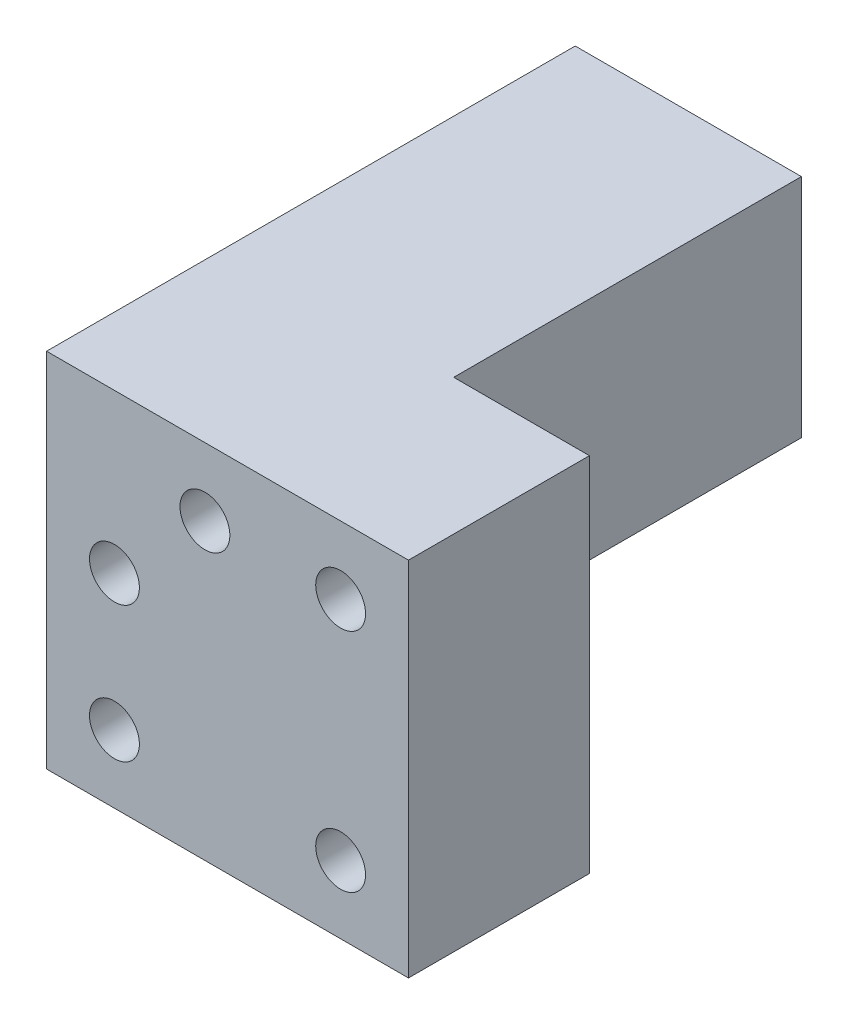
ISO-10303-21;
HEADER;
FILE_DESCRIPTION(('STEP AP214'),'2;1');
FILE_NAME('part.step','',(''),(''),'','','');
FILE_SCHEMA(('AUTOMOTIVE_DESIGN { 1 0 10303 214 1 1 1 1 }'));
ENDSEC;
DATA;
#1=APPLICATION_CONTEXT('core data for automotive mechanical design processes');
#2=APPLICATION_PROTOCOL_DEFINITION('international standard','automotive_design',2000,#1);
#3=PRODUCT_CONTEXT('',#1,'mechanical');
#4=PRODUCT('Part','Part','',(#3));
#5=PRODUCT_RELATED_PRODUCT_CATEGORY('part','',(#4));
#6=PRODUCT_DEFINITION_FORMATION('','',#4);
#7=PRODUCT_DEFINITION_CONTEXT('part definition',#1,'design');
#8=PRODUCT_DEFINITION('design','',#6,#7);
#9=PRODUCT_DEFINITION_SHAPE('','',#8);
#10=(LENGTH_UNIT() NAMED_UNIT(*) SI_UNIT(.MILLI.,.METRE.));
#11=(NAMED_UNIT(*) PLANE_ANGLE_UNIT() SI_UNIT($,.RADIAN.));
#12=(NAMED_UNIT(*) SI_UNIT($,.STERADIAN.) SOLID_ANGLE_UNIT());
#13=UNCERTAINTY_MEASURE_WITH_UNIT(LENGTH_MEASURE(1.E-05),#10,'distance_accuracy_value','');
#14=(GEOMETRIC_REPRESENTATION_CONTEXT(3) GLOBAL_UNCERTAINTY_ASSIGNED_CONTEXT((#13)) GLOBAL_UNIT_ASSIGNED_CONTEXT((#10,
#11,#12)) REPRESENTATION_CONTEXT('',''));
#15=CARTESIAN_POINT('',(0.,0.,0.));
#16=DIRECTION('',(0.,0.,1.));
#17=DIRECTION('',(1.,0.,0.));
#18=AXIS2_PLACEMENT_3D('',#15,#16,#17);
#19=CARTESIAN_POINT('',(-25.4,25.4,76.2));
#20=DIRECTION('',(1.,0.,0.));
#21=DIRECTION('',(0.,0.,-1.));
#22=AXIS2_PLACEMENT_3D('',#19,#20,#21);
#23=PLANE('',#22);
#24=DIRECTION('',(0.,0.,-1.));
#25=VECTOR('',#24,1.);
#26=CARTESIAN_POINT('',(-25.4,25.4,76.2));
#27=LINE('',#26,#25);
#28=CARTESIAN_POINT('',(-25.4,25.4,76.2));
#29=VERTEX_POINT('',#28);
#30=CARTESIAN_POINT('',(-25.4,25.4,1.99374988600003));
#31=VERTEX_POINT('',#30);
#32=EDGE_CURVE('E150',#29,#31,#27,.T.);
#33=ORIENTED_EDGE('',*,*,#32,.T.);
#34=DIRECTION('',(0.,-1.,0.));
#35=VECTOR('',#34,1.);
#36=CARTESIAN_POINT('',(-25.4,25.4,1.993749886));
#37=LINE('',#36,#35);
#38=CARTESIAN_POINT('',(-25.4,-6.35,1.993749886));
#39=VERTEX_POINT('',#38);
#40=EDGE_CURVE('E162',#31,#39,#37,.T.);
#41=ORIENTED_EDGE('',*,*,#40,.T.);
#42=DIRECTION('',(0.,0.,-1.));
#43=VECTOR('',#42,1.);
#44=CARTESIAN_POINT('',(-25.4,-6.35,50.8));
#45=LINE('',#44,#43);
#46=CARTESIAN_POINT('',(-25.4,-6.35,50.8));
#47=VERTEX_POINT('',#46);
#48=EDGE_CURVE('E138',#47,#39,#45,.T.);
#49=ORIENTED_EDGE('',*,*,#48,.F.);
#50=DIRECTION('',(0.,1.,0.));
#51=VECTOR('',#50,1.);
#52=CARTESIAN_POINT('',(-25.4,-25.4,50.8));
#53=LINE('',#52,#51);
#54=CARTESIAN_POINT('',(-25.4,-25.4,50.8));
#55=VERTEX_POINT('',#54);
#56=EDGE_CURVE('E113',#55,#47,#53,.T.);
#57=ORIENTED_EDGE('',*,*,#56,.F.);
#58=DIRECTION('',(0.,0.,-1.));
#59=VECTOR('',#58,1.);
#60=CARTESIAN_POINT('',(-25.4,-25.4,76.2));
#61=LINE('',#60,#59);
#62=CARTESIAN_POINT('',(-25.4,-25.4,76.2));
#63=VERTEX_POINT('',#62);
#64=EDGE_CURVE('E159',#63,#55,#61,.T.);
#65=ORIENTED_EDGE('',*,*,#64,.F.);
#66=DIRECTION('',(0.,-1.,0.));
#67=VECTOR('',#66,1.);
#68=CARTESIAN_POINT('',(-25.4,25.4,76.2));
#69=LINE('',#68,#67);
#70=EDGE_CURVE('E140',#29,#63,#69,.T.);
#71=ORIENTED_EDGE('',*,*,#70,.F.);
#72=EDGE_LOOP('',(#33,#41,#49,#57,#65,#71));
#73=FACE_BOUND('',#72,.T.);
#74=ADVANCED_FACE('F38',(#73),#23,.F.);
#75=CARTESIAN_POINT('',(-25.4,-25.4,76.2));
#76=DIRECTION('',(0.,1.,0.));
#77=DIRECTION('',(0.,0.,1.));
#78=AXIS2_PLACEMENT_3D('',#75,#76,#77);
#79=PLANE('',#78);
#80=ORIENTED_EDGE('',*,*,#64,.T.);
#81=DIRECTION('',(-1.,0.,0.));
#82=VECTOR('',#81,1.);
#83=CARTESIAN_POINT('',(25.4,-25.4,50.8));
#84=LINE('',#83,#82);
#85=CARTESIAN_POINT('',(25.4,-25.4,50.8));
#86=VERTEX_POINT('',#85);
#87=EDGE_CURVE('E135',#86,#55,#84,.T.);
#88=ORIENTED_EDGE('',*,*,#87,.F.);
#89=DIRECTION('',(0.,0.,-1.));
#90=VECTOR('',#89,1.);
#91=CARTESIAN_POINT('',(25.4,-25.4,76.2));
#92=LINE('',#91,#90);
#93=CARTESIAN_POINT('',(25.4,-25.4,76.2));
#94=VERTEX_POINT('',#93);
#95=EDGE_CURVE('E156',#94,#86,#92,.T.);
#96=ORIENTED_EDGE('',*,*,#95,.F.);
#97=DIRECTION('',(1.,0.,0.));
#98=VECTOR('',#97,1.);
#99=CARTESIAN_POINT('',(-25.4,-25.4,76.2));
#100=LINE('',#99,#98);
#101=EDGE_CURVE('E144',#63,#94,#100,.T.);
#102=ORIENTED_EDGE('',*,*,#101,.F.);
#103=EDGE_LOOP('',(#80,#88,#96,#102));
#104=FACE_BOUND('',#103,.T.);
#105=ADVANCED_FACE('F227',(#104),#79,.F.);
#106=CARTESIAN_POINT('',(25.4,25.4,76.2));
#107=DIRECTION('',(-1.,0.,0.));
#108=DIRECTION('',(0.,0.,1.));
#109=AXIS2_PLACEMENT_3D('',#106,#107,#108);
#110=PLANE('',#109);
#111=ORIENTED_EDGE('',*,*,#95,.T.);
#112=DIRECTION('',(0.,-1.,0.));
#113=VECTOR('',#112,1.);
#114=CARTESIAN_POINT('',(25.4,25.4,50.8));
#115=LINE('',#114,#113);
#116=CARTESIAN_POINT('',(25.4,25.4,50.8));
#117=VERTEX_POINT('',#116);
#118=EDGE_CURVE('E133',#117,#86,#115,.T.);
#119=ORIENTED_EDGE('',*,*,#118,.F.);
#120=DIRECTION('',(0.,0.,-1.));
#121=VECTOR('',#120,1.);
#122=CARTESIAN_POINT('',(25.4,25.4,76.2));
#123=LINE('',#122,#121);
#124=CARTESIAN_POINT('',(25.4,25.4,76.2));
#125=VERTEX_POINT('',#124);
#126=EDGE_CURVE('E153',#125,#117,#123,.T.);
#127=ORIENTED_EDGE('',*,*,#126,.F.);
#128=DIRECTION('',(0.,1.,0.));
#129=VECTOR('',#128,1.);
#130=CARTESIAN_POINT('',(25.4,25.4,76.2));
#131=LINE('',#130,#129);
#132=EDGE_CURVE('E146',#94,#125,#131,.T.);
#133=ORIENTED_EDGE('',*,*,#132,.F.);
#134=EDGE_LOOP('',(#111,#119,#127,#133));
#135=FACE_BOUND('',#134,.T.);
#136=ADVANCED_FACE('F223',(#135),#110,.F.);
#137=CARTESIAN_POINT('',(-25.4,25.4,76.2));
#138=DIRECTION('',(0.,-1.,0.));
#139=DIRECTION('',(0.,0.,-1.));
#140=AXIS2_PLACEMENT_3D('',#137,#138,#139);
#141=PLANE('',#140);
#142=DIRECTION('',(0.,0.,-1.));
#143=VECTOR('',#142,1.);
#144=CARTESIAN_POINT('',(6.35000000000001,25.4,50.8));
#145=LINE('',#144,#143);
#146=CARTESIAN_POINT('',(6.35000000000001,25.4,50.8));
#147=VERTEX_POINT('',#146);
#148=CARTESIAN_POINT('',(6.35000000000001,25.4,1.993749886));
#149=VERTEX_POINT('',#148);
#150=EDGE_CURVE('E112',#147,#149,#145,.T.);
#151=ORIENTED_EDGE('',*,*,#150,.T.);
#152=DIRECTION('',(-1.,0.,0.));
#153=VECTOR('',#152,1.);
#154=CARTESIAN_POINT('',(-25.4,25.4,1.993749886));
#155=LINE('',#154,#153);
#156=EDGE_CURVE('E183',#149,#31,#155,.T.);
#157=ORIENTED_EDGE('',*,*,#156,.T.);
#158=ORIENTED_EDGE('',*,*,#32,.F.);
#159=DIRECTION('',(-1.,0.,0.));
#160=VECTOR('',#159,1.);
#161=CARTESIAN_POINT('',(-25.4,25.4,76.2));
#162=LINE('',#161,#160);
#163=EDGE_CURVE('E148',#125,#29,#162,.T.);
#164=ORIENTED_EDGE('',*,*,#163,.F.);
#165=ORIENTED_EDGE('',*,*,#126,.T.);
#166=DIRECTION('',(1.,0.,0.));
#167=VECTOR('',#166,1.);
#168=CARTESIAN_POINT('',(6.35000000000001,25.4,50.8));
#169=LINE('',#168,#167);
#170=EDGE_CURVE('E120',#147,#117,#169,.T.);
#171=ORIENTED_EDGE('',*,*,#170,.F.);
#172=EDGE_LOOP('',(#151,#157,#158,#164,#165,#171));
#173=FACE_BOUND('',#172,.T.);
#174=ADVANCED_FACE('F218',(#173),#141,.F.);
#175=CARTESIAN_POINT('',(0.,0.,76.2));
#176=DIRECTION('',(0.,0.,1.));
#177=DIRECTION('',(1.,0.,0.));
#178=AXIS2_PLACEMENT_3D('',#175,#176,#177);
#179=PLANE('',#178);
#180=CARTESIAN_POINT('',(-15.875,3.17499999999999,76.2));
#181=DIRECTION('',(0.,0.,-1.));
#182=DIRECTION('',(-1.,0.,0.));
#183=AXIS2_PLACEMENT_3D('',#180,#181,#182);
#184=CIRCLE('',#183,3.49999999999997);
#185=CARTESIAN_POINT('',(-19.375,3.17499999999999,76.2));
#186=VERTEX_POINT('',#185);
#187=EDGE_CURVE('E171',#186,#186,#184,.T.);
#188=ORIENTED_EDGE('',*,*,#187,.T.);
#189=EDGE_LOOP('',(#188));
#190=FACE_BOUND('',#189,.T.);
#191=CARTESIAN_POINT('',(-3.17499999999999,15.875,76.2));
#192=DIRECTION('',(0.,0.,-1.));
#193=DIRECTION('',(-1.,0.,0.));
#194=AXIS2_PLACEMENT_3D('',#191,#192,#193);
#195=CIRCLE('',#194,3.49999999999997);
#196=CARTESIAN_POINT('',(-6.67499999999996,15.875,76.2));
#197=VERTEX_POINT('',#196);
#198=EDGE_CURVE('E544',#197,#197,#195,.T.);
#199=ORIENTED_EDGE('',*,*,#198,.T.);
#200=EDGE_LOOP('',(#199));
#201=FACE_BOUND('',#200,.T.);
#202=CARTESIAN_POINT('',(15.875,15.875,76.2));
#203=DIRECTION('',(0.,0.,-1.));
#204=DIRECTION('',(-1.,0.,0.));
#205=AXIS2_PLACEMENT_3D('',#202,#203,#204);
#206=CIRCLE('',#205,3.5);
#207=CARTESIAN_POINT('',(12.375,15.875,76.2));
#208=VERTEX_POINT('',#207);
#209=EDGE_CURVE('E534',#208,#208,#206,.T.);
#210=ORIENTED_EDGE('',*,*,#209,.T.);
#211=EDGE_LOOP('',(#210));
#212=FACE_BOUND('',#211,.T.);
#213=CARTESIAN_POINT('',(-15.875,-15.875,76.2));
#214=DIRECTION('',(0.,0.,-1.));
#215=DIRECTION('',(-1.,0.,0.));
#216=AXIS2_PLACEMENT_3D('',#213,#214,#215);
#217=CIRCLE('',#216,3.5);
#218=CARTESIAN_POINT('',(-19.375,-15.875,76.2));
#219=VERTEX_POINT('',#218);
#220=EDGE_CURVE('E515',#219,#219,#217,.T.);
#221=ORIENTED_EDGE('',*,*,#220,.T.);
#222=EDGE_LOOP('',(#221));
#223=FACE_BOUND('',#222,.T.);
#224=CARTESIAN_POINT('',(15.875,-15.875,76.2));
#225=DIRECTION('',(0.,0.,-1.));
#226=DIRECTION('',(-1.,0.,0.));
#227=AXIS2_PLACEMENT_3D('',#224,#225,#226);
#228=CIRCLE('',#227,3.5);
#229=CARTESIAN_POINT('',(12.375,-15.875,76.2));
#230=VERTEX_POINT('',#229);
#231=EDGE_CURVE('E125',#230,#230,#228,.T.);
#232=ORIENTED_EDGE('',*,*,#231,.T.);
#233=EDGE_LOOP('',(#232));
#234=FACE_BOUND('',#233,.T.);
#235=ORIENTED_EDGE('',*,*,#70,.T.);
#236=ORIENTED_EDGE('',*,*,#101,.T.);
#237=ORIENTED_EDGE('',*,*,#132,.T.);
#238=ORIENTED_EDGE('',*,*,#163,.T.);
#239=EDGE_LOOP('',(#235,#236,#237,#238));
#240=FACE_BOUND('',#239,.T.);
#241=ADVANCED_FACE('F229',(#190,#201,#212,#223,#234,#240),#179,.T.);
#242=CARTESIAN_POINT('',(0.,0.,1.199999886));
#243=DIRECTION('',(0.,0.,1.));
#244=DIRECTION('',(1.,0.,0.));
#245=AXIS2_PLACEMENT_3D('',#242,#243,#244);
#246=PLANE('',#245);
#247=DIRECTION('',(-1.,0.,0.));
#248=VECTOR('',#247,1.);
#249=CARTESIAN_POINT('',(0.,-5.55625,1.199999886));
#250=LINE('',#249,#248);
#251=CARTESIAN_POINT('',(5.55625000000002,-5.55625000000001,1.199999886));
#252=VERTEX_POINT('',#251);
#253=CARTESIAN_POINT('',(-24.60625,-5.55625,1.199999886));
#254=VERTEX_POINT('',#253);
#255=EDGE_CURVE('E174',#252,#254,#250,.T.);
#256=ORIENTED_EDGE('',*,*,#255,.T.);
#257=DIRECTION('',(0.,1.,0.));
#258=VECTOR('',#257,1.);
#259=CARTESIAN_POINT('',(-24.60625,0.,1.199999886));
#260=LINE('',#259,#258);
#261=CARTESIAN_POINT('',(-24.60625,24.60625,1.199999886));
#262=VERTEX_POINT('',#261);
#263=EDGE_CURVE('E180',#254,#262,#260,.T.);
#264=ORIENTED_EDGE('',*,*,#263,.T.);
#265=DIRECTION('',(1.,0.,0.));
#266=VECTOR('',#265,1.);
#267=CARTESIAN_POINT('',(0.,24.60625,1.199999886));
#268=LINE('',#267,#266);
#269=CARTESIAN_POINT('',(5.55625000000002,24.60625,1.199999886));
#270=VERTEX_POINT('',#269);
#271=EDGE_CURVE('E178',#262,#270,#268,.T.);
#272=ORIENTED_EDGE('',*,*,#271,.T.);
#273=DIRECTION('',(0.,-1.,0.));
#274=VECTOR('',#273,1.);
#275=CARTESIAN_POINT('',(5.55625000000002,0.,1.199999886));
#276=LINE('',#275,#274);
#277=EDGE_CURVE('E176',#270,#252,#276,.T.);
#278=ORIENTED_EDGE('',*,*,#277,.T.);
#279=EDGE_LOOP('',(#256,#264,#272,#278));
#280=FACE_BOUND('',#279,.T.);
#281=CARTESIAN_POINT('',(-15.875,3.17499999999999,1.199999886));
#282=DIRECTION('',(0.,0.,1.));
#283=DIRECTION('',(1.,0.,0.));
#284=AXIS2_PLACEMENT_3D('',#281,#282,#283);
#285=CIRCLE('',#284,5.5);
#286=CARTESIAN_POINT('',(-10.375,3.17499999999999,1.199999886));
#287=VERTEX_POINT('',#286);
#288=EDGE_CURVE('E163',#287,#287,#285,.F.);
#289=ORIENTED_EDGE('',*,*,#288,.F.);
#290=EDGE_LOOP('',(#289));
#291=FACE_BOUND('',#290,.T.);
#292=CARTESIAN_POINT('',(-3.17499999999999,15.875,1.199999886));
#293=DIRECTION('',(0.,0.,1.));
#294=DIRECTION('',(1.,0.,0.));
#295=AXIS2_PLACEMENT_3D('',#292,#293,#294);
#296=CIRCLE('',#295,5.5);
#297=CARTESIAN_POINT('',(2.32500000000001,15.875,1.199999886));
#298=VERTEX_POINT('',#297);
#299=EDGE_CURVE('E167',#298,#298,#296,.F.);
#300=ORIENTED_EDGE('',*,*,#299,.F.);
#301=EDGE_LOOP('',(#300));
#302=FACE_BOUND('',#301,.T.);
#303=ADVANCED_FACE('F204',(#280,#291,#302),#246,.F.);
#304=CARTESIAN_POINT('',(-25.4,-6.35,50.8));
#305=DIRECTION('',(0.,1.,0.));
#306=DIRECTION('',(-1.,0.,0.));
#307=AXIS2_PLACEMENT_3D('',#304,#305,#306);
#308=PLANE('',#307);
#309=ORIENTED_EDGE('',*,*,#48,.T.);
#310=DIRECTION('',(1.,0.,0.));
#311=VECTOR('',#310,1.);
#312=CARTESIAN_POINT('',(-25.4,-6.35,1.993749886));
#313=LINE('',#312,#311);
#314=CARTESIAN_POINT('',(6.35000000000001,-6.35,1.993749886));
#315=VERTEX_POINT('',#314);
#316=EDGE_CURVE('E12',#39,#315,#313,.T.);
#317=ORIENTED_EDGE('',*,*,#316,.T.);
#318=DIRECTION('',(0.,0.,-1.));
#319=VECTOR('',#318,1.);
#320=CARTESIAN_POINT('',(6.35000000000001,-6.35,50.8));
#321=LINE('',#320,#319);
#322=CARTESIAN_POINT('',(6.35000000000001,-6.35,50.8));
#323=VERTEX_POINT('',#322);
#324=EDGE_CURVE('E106',#323,#315,#321,.T.);
#325=ORIENTED_EDGE('',*,*,#324,.F.);
#326=DIRECTION('',(1.,0.,0.));
#327=VECTOR('',#326,1.);
#328=CARTESIAN_POINT('',(-25.4,-6.35,50.8));
#329=LINE('',#328,#327);
#330=EDGE_CURVE('E110',#47,#323,#329,.T.);
#331=ORIENTED_EDGE('',*,*,#330,.F.);
#332=EDGE_LOOP('',(#309,#317,#325,#331));
#333=FACE_BOUND('',#332,.T.);
#334=ADVANCED_FACE('F108',(#333),#308,.F.);
#335=CARTESIAN_POINT('',(6.35000000000001,-6.35,50.8));
#336=DIRECTION('',(-1.,0.,0.));
#337=DIRECTION('',(0.,0.,1.));
#338=AXIS2_PLACEMENT_3D('',#335,#336,#337);
#339=PLANE('',#338);
#340=ORIENTED_EDGE('',*,*,#324,.T.);
#341=DIRECTION('',(0.,1.,0.));
#342=VECTOR('',#341,1.);
#343=CARTESIAN_POINT('',(6.35000000000001,-6.35,1.993749886));
#344=LINE('',#343,#342);
#345=EDGE_CURVE('E47',#315,#149,#344,.T.);
#346=ORIENTED_EDGE('',*,*,#345,.T.);
#347=ORIENTED_EDGE('',*,*,#150,.F.);
#348=DIRECTION('',(0.,1.,0.));
#349=VECTOR('',#348,1.);
#350=CARTESIAN_POINT('',(6.35000000000001,-6.35,50.8));
#351=LINE('',#350,#349);
#352=EDGE_CURVE('E116',#323,#147,#351,.T.);
#353=ORIENTED_EDGE('',*,*,#352,.F.);
#354=EDGE_LOOP('',(#340,#346,#347,#353));
#355=FACE_BOUND('',#354,.T.);
#356=ADVANCED_FACE('F117',(#355),#339,.F.);
#357=CARTESIAN_POINT('',(0.,0.,50.8));
#358=DIRECTION('',(0.,0.,1.));
#359=DIRECTION('',(1.,0.,0.));
#360=AXIS2_PLACEMENT_3D('',#357,#358,#359);
#361=PLANE('',#360);
#362=CARTESIAN_POINT('',(15.875,15.875,50.8));
#363=DIRECTION('',(0.,0.,-1.));
#364=DIRECTION('',(-1.,0.,0.));
#365=AXIS2_PLACEMENT_3D('',#362,#363,#364);
#366=CIRCLE('',#365,5.5);
#367=CARTESIAN_POINT('',(10.375,15.875,50.8));
#368=VERTEX_POINT('',#367);
#369=EDGE_CURVE('E505',#368,#368,#366,.T.);
#370=ORIENTED_EDGE('',*,*,#369,.F.);
#371=EDGE_LOOP('',(#370));
#372=FACE_BOUND('',#371,.T.);
#373=CARTESIAN_POINT('',(-15.875,-15.875,50.8));
#374=DIRECTION('',(0.,0.,-1.));
#375=DIRECTION('',(-1.,0.,0.));
#376=AXIS2_PLACEMENT_3D('',#373,#374,#375);
#377=CIRCLE('',#376,5.5);
#378=CARTESIAN_POINT('',(-21.375,-15.875,50.8));
#379=VERTEX_POINT('',#378);
#380=EDGE_CURVE('E509',#379,#379,#377,.T.);
#381=ORIENTED_EDGE('',*,*,#380,.F.);
#382=EDGE_LOOP('',(#381));
#383=FACE_BOUND('',#382,.T.);
#384=CARTESIAN_POINT('',(15.875,-15.875,50.8));
#385=DIRECTION('',(0.,0.,-1.));
#386=DIRECTION('',(-1.,0.,0.));
#387=AXIS2_PLACEMENT_3D('',#384,#385,#386);
#388=CIRCLE('',#387,5.5);
#389=CARTESIAN_POINT('',(10.375,-15.875,50.8));
#390=VERTEX_POINT('',#389);
#391=EDGE_CURVE('E512',#390,#390,#388,.T.);
#392=ORIENTED_EDGE('',*,*,#391,.F.);
#393=EDGE_LOOP('',(#392));
#394=FACE_BOUND('',#393,.T.);
#395=ORIENTED_EDGE('',*,*,#330,.T.);
#396=ORIENTED_EDGE('',*,*,#352,.T.);
#397=ORIENTED_EDGE('',*,*,#170,.T.);
#398=ORIENTED_EDGE('',*,*,#118,.T.);
#399=ORIENTED_EDGE('',*,*,#87,.T.);
#400=ORIENTED_EDGE('',*,*,#56,.T.);
#401=EDGE_LOOP('',(#395,#396,#397,#398,#399,#400));
#402=FACE_BOUND('',#401,.T.);
#403=ADVANCED_FACE('F122',(#372,#383,#394,#402),#361,.F.);
#404=CARTESIAN_POINT('',(15.875,-15.875,50.8));
#405=DIRECTION('',(0.,0.,-1.));
#406=DIRECTION('',(-1.,0.,0.));
#407=AXIS2_PLACEMENT_3D('',#404,#405,#406);
#408=CYLINDRICAL_SURFACE('',#407,3.5);
#409=ORIENTED_EDGE('',*,*,#231,.F.);
#410=EDGE_LOOP('',(#409));
#411=FACE_BOUND('',#410,.T.);
#412=CARTESIAN_POINT('',(15.875,-15.875,56.8));
#413=DIRECTION('',(0.,0.,-1.));
#414=DIRECTION('',(-1.,0.,0.));
#415=AXIS2_PLACEMENT_3D('',#412,#413,#414);
#416=CIRCLE('',#415,3.5);
#417=CARTESIAN_POINT('',(12.375,-15.875,56.8));
#418=VERTEX_POINT('',#417);
#419=EDGE_CURVE('E128',#418,#418,#416,.T.);
#420=ORIENTED_EDGE('',*,*,#419,.T.);
#421=EDGE_LOOP('',(#420));
#422=FACE_BOUND('',#421,.T.);
#423=ADVANCED_FACE('F319',(#411,#422),#408,.F.);
#424=CARTESIAN_POINT('',(19.375,-15.875,56.8));
#425=DIRECTION('',(0.,0.,1.));
#426=DIRECTION('',(1.,0.,0.));
#427=AXIS2_PLACEMENT_3D('',#424,#425,#426);
#428=PLANE('',#427);
#429=ORIENTED_EDGE('',*,*,#419,.F.);
#430=EDGE_LOOP('',(#429));
#431=FACE_BOUND('',#430,.T.);
#432=CARTESIAN_POINT('',(15.875,-15.875,56.8));
#433=DIRECTION('',(0.,0.,-1.));
#434=DIRECTION('',(-1.,0.,0.));
#435=AXIS2_PLACEMENT_3D('',#432,#433,#434);
#436=CIRCLE('',#435,5.5);
#437=CARTESIAN_POINT('',(10.375,-15.875,56.8));
#438=VERTEX_POINT('',#437);
#439=EDGE_CURVE('E514',#438,#438,#436,.T.);
#440=ORIENTED_EDGE('',*,*,#439,.T.);
#441=EDGE_LOOP('',(#440));
#442=FACE_BOUND('',#441,.T.);
#443=ADVANCED_FACE('F315',(#431,#442),#428,.F.);
#444=CARTESIAN_POINT('',(15.875,-15.875,50.8));
#445=DIRECTION('',(0.,0.,-1.));
#446=DIRECTION('',(-1.,0.,0.));
#447=AXIS2_PLACEMENT_3D('',#444,#445,#446);
#448=CYLINDRICAL_SURFACE('',#447,5.5);
#449=ORIENTED_EDGE('',*,*,#439,.F.);
#450=EDGE_LOOP('',(#449));
#451=FACE_BOUND('',#450,.T.);
#452=ORIENTED_EDGE('',*,*,#391,.T.);
#453=EDGE_LOOP('',(#452));
#454=FACE_BOUND('',#453,.T.);
#455=ADVANCED_FACE('F311',(#451,#454),#448,.F.);
#456=CARTESIAN_POINT('',(-15.875,-15.875,50.8));
#457=DIRECTION('',(0.,0.,-1.));
#458=DIRECTION('',(-1.,0.,0.));
#459=AXIS2_PLACEMENT_3D('',#456,#457,#458);
#460=CYLINDRICAL_SURFACE('',#459,3.5);
#461=ORIENTED_EDGE('',*,*,#220,.F.);
#462=EDGE_LOOP('',(#461));
#463=FACE_BOUND('',#462,.T.);
#464=CARTESIAN_POINT('',(-15.875,-15.875,56.8));
#465=DIRECTION('',(0.,0.,-1.));
#466=DIRECTION('',(-1.,0.,0.));
#467=AXIS2_PLACEMENT_3D('',#464,#465,#466);
#468=CIRCLE('',#467,3.5);
#469=CARTESIAN_POINT('',(-19.375,-15.875,56.8));
#470=VERTEX_POINT('',#469);
#471=EDGE_CURVE('E520',#470,#470,#468,.T.);
#472=ORIENTED_EDGE('',*,*,#471,.T.);
#473=EDGE_LOOP('',(#472));
#474=FACE_BOUND('',#473,.T.);
#475=ADVANCED_FACE('F307',(#463,#474),#460,.F.);
#476=CARTESIAN_POINT('',(-12.375,-15.875,56.8));
#477=DIRECTION('',(0.,0.,1.));
#478=DIRECTION('',(1.,0.,0.));
#479=AXIS2_PLACEMENT_3D('',#476,#477,#478);
#480=PLANE('',#479);
#481=ORIENTED_EDGE('',*,*,#471,.F.);
#482=EDGE_LOOP('',(#481));
#483=FACE_BOUND('',#482,.T.);
#484=CARTESIAN_POINT('',(-15.875,-15.875,56.8));
#485=DIRECTION('',(0.,0.,-1.));
#486=DIRECTION('',(-1.,0.,0.));
#487=AXIS2_PLACEMENT_3D('',#484,#485,#486);
#488=CIRCLE('',#487,5.5);
#489=CARTESIAN_POINT('',(-21.375,-15.875,56.8));
#490=VERTEX_POINT('',#489);
#491=EDGE_CURVE('E530',#490,#490,#488,.T.);
#492=ORIENTED_EDGE('',*,*,#491,.T.);
#493=EDGE_LOOP('',(#492));
#494=FACE_BOUND('',#493,.T.);
#495=ADVANCED_FACE('F303',(#483,#494),#480,.F.);
#496=CARTESIAN_POINT('',(-15.875,-15.875,50.8));
#497=DIRECTION('',(0.,0.,-1.));
#498=DIRECTION('',(-1.,0.,0.));
#499=AXIS2_PLACEMENT_3D('',#496,#497,#498);
#500=CYLINDRICAL_SURFACE('',#499,5.5);
#501=ORIENTED_EDGE('',*,*,#491,.F.);
#502=EDGE_LOOP('',(#501));
#503=FACE_BOUND('',#502,.T.);
#504=ORIENTED_EDGE('',*,*,#380,.T.);
#505=EDGE_LOOP('',(#504));
#506=FACE_BOUND('',#505,.T.);
#507=ADVANCED_FACE('F299',(#503,#506),#500,.F.);
#508=CARTESIAN_POINT('',(15.875,15.875,50.8));
#509=DIRECTION('',(0.,0.,-1.));
#510=DIRECTION('',(-1.,0.,0.));
#511=AXIS2_PLACEMENT_3D('',#508,#509,#510);
#512=CYLINDRICAL_SURFACE('',#511,3.5);
#513=ORIENTED_EDGE('',*,*,#209,.F.);
#514=EDGE_LOOP('',(#513));
#515=FACE_BOUND('',#514,.T.);
#516=CARTESIAN_POINT('',(15.875,15.875,56.8));
#517=DIRECTION('',(0.,0.,-1.));
#518=DIRECTION('',(-1.,0.,0.));
#519=AXIS2_PLACEMENT_3D('',#516,#517,#518);
#520=CIRCLE('',#519,3.5);
#521=CARTESIAN_POINT('',(12.375,15.875,56.8));
#522=VERTEX_POINT('',#521);
#523=EDGE_CURVE('E537',#522,#522,#520,.T.);
#524=ORIENTED_EDGE('',*,*,#523,.T.);
#525=EDGE_LOOP('',(#524));
#526=FACE_BOUND('',#525,.T.);
#527=ADVANCED_FACE('F295',(#515,#526),#512,.F.);
#528=CARTESIAN_POINT('',(19.375,15.875,56.8));
#529=DIRECTION('',(0.,0.,1.));
#530=DIRECTION('',(1.,0.,0.));
#531=AXIS2_PLACEMENT_3D('',#528,#529,#530);
#532=PLANE('',#531);
#533=ORIENTED_EDGE('',*,*,#523,.F.);
#534=EDGE_LOOP('',(#533));
#535=FACE_BOUND('',#534,.T.);
#536=CARTESIAN_POINT('',(15.875,15.875,56.8));
#537=DIRECTION('',(0.,0.,-1.));
#538=DIRECTION('',(-1.,0.,0.));
#539=AXIS2_PLACEMENT_3D('',#536,#537,#538);
#540=CIRCLE('',#539,5.5);
#541=CARTESIAN_POINT('',(10.375,15.875,56.8));
#542=VERTEX_POINT('',#541);
#543=EDGE_CURVE('E540',#542,#542,#540,.T.);
#544=ORIENTED_EDGE('',*,*,#543,.T.);
#545=EDGE_LOOP('',(#544));
#546=FACE_BOUND('',#545,.T.);
#547=ADVANCED_FACE('F291',(#535,#546),#532,.F.);
#548=CARTESIAN_POINT('',(15.875,15.875,50.8));
#549=DIRECTION('',(0.,0.,-1.));
#550=DIRECTION('',(-1.,0.,0.));
#551=AXIS2_PLACEMENT_3D('',#548,#549,#550);
#552=CYLINDRICAL_SURFACE('',#551,5.5);
#553=ORIENTED_EDGE('',*,*,#543,.F.);
#554=EDGE_LOOP('',(#553));
#555=FACE_BOUND('',#554,.T.);
#556=ORIENTED_EDGE('',*,*,#369,.T.);
#557=EDGE_LOOP('',(#556));
#558=FACE_BOUND('',#557,.T.);
#559=ADVANCED_FACE('F287',(#555,#558),#552,.F.);
#560=CARTESIAN_POINT('',(-3.17499999999999,15.875,0.));
#561=DIRECTION('',(0.,0.,-1.));
#562=DIRECTION('',(-1.,0.,0.));
#563=AXIS2_PLACEMENT_3D('',#560,#561,#562);
#564=CYLINDRICAL_SURFACE('',#563,3.49999999999999);
#565=ORIENTED_EDGE('',*,*,#198,.F.);
#566=EDGE_LOOP('',(#565));
#567=FACE_BOUND('',#566,.T.);
#568=CARTESIAN_POINT('',(-3.17499999999999,15.875,9.175));
#569=DIRECTION('',(0.,0.,-1.));
#570=DIRECTION('',(-1.,0.,0.));
#571=AXIS2_PLACEMENT_3D('',#568,#569,#570);
#572=CIRCLE('',#571,3.5);
#573=CARTESIAN_POINT('',(-6.67499999999998,15.875,9.175));
#574=VERTEX_POINT('',#573);
#575=EDGE_CURVE('E547',#574,#574,#572,.T.);
#576=ORIENTED_EDGE('',*,*,#575,.T.);
#577=EDGE_LOOP('',(#576));
#578=FACE_BOUND('',#577,.T.);
#579=ADVANCED_FACE('F283',(#567,#578),#564,.F.);
#580=CARTESIAN_POINT('',(0.325000000000012,15.875,9.175));
#581=DIRECTION('',(0.,0.,1.));
#582=DIRECTION('',(1.,0.,0.));
#583=AXIS2_PLACEMENT_3D('',#580,#581,#582);
#584=PLANE('',#583);
#585=ORIENTED_EDGE('',*,*,#575,.F.);
#586=EDGE_LOOP('',(#585));
#587=FACE_BOUND('',#586,.T.);
#588=CARTESIAN_POINT('',(-3.17499999999999,15.875,9.175));
#589=DIRECTION('',(0.,0.,-1.));
#590=DIRECTION('',(-1.,0.,0.));
#591=AXIS2_PLACEMENT_3D('',#588,#589,#590);
#592=CIRCLE('',#591,5.5);
#593=CARTESIAN_POINT('',(-8.67499999999998,15.875,9.175));
#594=VERTEX_POINT('',#593);
#595=EDGE_CURVE('E170',#594,#594,#592,.T.);
#596=ORIENTED_EDGE('',*,*,#595,.T.);
#597=EDGE_LOOP('',(#596));
#598=FACE_BOUND('',#597,.T.);
#599=ADVANCED_FACE('F279',(#587,#598),#584,.F.);
#600=CARTESIAN_POINT('',(-3.17499999999999,15.875,0.));
#601=DIRECTION('',(0.,0.,-1.));
#602=DIRECTION('',(-1.,0.,0.));
#603=AXIS2_PLACEMENT_3D('',#600,#601,#602);
#604=CYLINDRICAL_SURFACE('',#603,5.5);
#605=ORIENTED_EDGE('',*,*,#595,.F.);
#606=EDGE_LOOP('',(#605));
#607=FACE_BOUND('',#606,.T.);
#608=ORIENTED_EDGE('',*,*,#299,.T.);
#609=EDGE_LOOP('',(#608));
#610=FACE_BOUND('',#609,.T.);
#611=ADVANCED_FACE('F275',(#607,#610),#604,.F.);
#612=CARTESIAN_POINT('',(-15.875,3.17499999999999,0.));
#613=DIRECTION('',(0.,0.,-1.));
#614=DIRECTION('',(-1.,0.,0.));
#615=AXIS2_PLACEMENT_3D('',#612,#613,#614);
#616=CYLINDRICAL_SURFACE('',#615,3.49999999999999);
#617=ORIENTED_EDGE('',*,*,#187,.F.);
#618=EDGE_LOOP('',(#617));
#619=FACE_BOUND('',#618,.T.);
#620=CARTESIAN_POINT('',(-15.875,3.17499999999999,9.175));
#621=DIRECTION('',(0.,0.,-1.));
#622=DIRECTION('',(-1.,0.,0.));
#623=AXIS2_PLACEMENT_3D('',#620,#621,#622);
#624=CIRCLE('',#623,3.5);
#625=CARTESIAN_POINT('',(-19.375,3.17499999999999,9.175));
#626=VERTEX_POINT('',#625);
#627=EDGE_CURVE('E553',#626,#626,#624,.T.);
#628=ORIENTED_EDGE('',*,*,#627,.T.);
#629=EDGE_LOOP('',(#628));
#630=FACE_BOUND('',#629,.T.);
#631=ADVANCED_FACE('F267',(#619,#630),#616,.F.);
#632=CARTESIAN_POINT('',(-12.375,3.17499999999999,9.175));
#633=DIRECTION('',(0.,0.,1.));
#634=DIRECTION('',(1.,0.,0.));
#635=AXIS2_PLACEMENT_3D('',#632,#633,#634);
#636=PLANE('',#635);
#637=ORIENTED_EDGE('',*,*,#627,.F.);
#638=EDGE_LOOP('',(#637));
#639=FACE_BOUND('',#638,.T.);
#640=CARTESIAN_POINT('',(-15.875,3.17499999999999,9.175));
#641=DIRECTION('',(0.,0.,-1.));
#642=DIRECTION('',(-1.,0.,0.));
#643=AXIS2_PLACEMENT_3D('',#640,#641,#642);
#644=CIRCLE('',#643,5.5);
#645=CARTESIAN_POINT('',(-21.375,3.17499999999999,9.175));
#646=VERTEX_POINT('',#645);
#647=EDGE_CURVE('E166',#646,#646,#644,.T.);
#648=ORIENTED_EDGE('',*,*,#647,.T.);
#649=EDGE_LOOP('',(#648));
#650=FACE_BOUND('',#649,.T.);
#651=ADVANCED_FACE('F261',(#639,#650),#636,.F.);
#652=CARTESIAN_POINT('',(-15.875,3.17499999999999,0.));
#653=DIRECTION('',(0.,0.,-1.));
#654=DIRECTION('',(-1.,0.,0.));
#655=AXIS2_PLACEMENT_3D('',#652,#653,#654);
#656=CYLINDRICAL_SURFACE('',#655,5.5);
#657=ORIENTED_EDGE('',*,*,#647,.F.);
#658=EDGE_LOOP('',(#657));
#659=FACE_BOUND('',#658,.T.);
#660=ORIENTED_EDGE('',*,*,#288,.T.);
#661=EDGE_LOOP('',(#660));
#662=FACE_BOUND('',#661,.T.);
#663=ADVANCED_FACE('F257',(#659,#662),#656,.F.);
#664=CARTESIAN_POINT('',(6.35000000000001,-6.35,1.993749886));
#665=DIRECTION('',(-0.707106781186549,0.,0.707106781186546));
#666=DIRECTION('',(0.,1.,0.));
#667=AXIS2_PLACEMENT_3D('',#664,#665,#666);
#668=PLANE('',#667);
#669=DIRECTION('',(0.577350269189625,-0.577350269189625,0.577350269189627));
#670=VECTOR('',#669,1.);
#671=CARTESIAN_POINT('',(-4.2333333333333,4.23333333333332,-8.58958344733335));
#672=LINE('',#671,#670);
#673=EDGE_CURVE('E189',#252,#315,#672,.T.);
#674=ORIENTED_EDGE('',*,*,#673,.F.);
#675=ORIENTED_EDGE('',*,*,#277,.F.);
#676=DIRECTION('',(0.577350269189625,0.577350269189625,0.577350269189627));
#677=VECTOR('',#676,1.);
#678=CARTESIAN_POINT('',(-4.2333333333333,14.8166666666667,-8.58958344733335));
#679=LINE('',#678,#677);
#680=EDGE_CURVE('E42',#149,#270,#679,.F.);
#681=ORIENTED_EDGE('',*,*,#680,.F.);
#682=ORIENTED_EDGE('',*,*,#345,.F.);
#683=EDGE_LOOP('',(#674,#675,#681,#682));
#684=FACE_BOUND('',#683,.T.);
#685=ADVANCED_FACE('F40',(#684),#668,.F.);
#686=CARTESIAN_POINT('',(-25.4,25.4,1.993749886));
#687=DIRECTION('',(0.,-0.707106781186549,0.707106781186546));
#688=DIRECTION('',(-1.,0.,0.));
#689=AXIS2_PLACEMENT_3D('',#686,#687,#688);
#690=PLANE('',#689);
#691=ORIENTED_EDGE('',*,*,#680,.T.);
#692=ORIENTED_EDGE('',*,*,#271,.F.);
#693=DIRECTION('',(-0.577350269189625,0.577350269189625,0.577350269189627));
#694=VECTOR('',#693,1.);
#695=CARTESIAN_POINT('',(-25.4,25.4,1.993749886));
#696=LINE('',#695,#694);
#697=EDGE_CURVE('E188',#31,#262,#696,.F.);
#698=ORIENTED_EDGE('',*,*,#697,.F.);
#699=ORIENTED_EDGE('',*,*,#156,.F.);
#700=EDGE_LOOP('',(#691,#692,#698,#699));
#701=FACE_BOUND('',#700,.T.);
#702=ADVANCED_FACE('F199',(#701),#690,.F.);
#703=CARTESIAN_POINT('',(-25.4,-6.35,1.993749886));
#704=DIRECTION('',(0.,0.707106781186549,0.707106781186546));
#705=DIRECTION('',(1.,0.,0.));
#706=AXIS2_PLACEMENT_3D('',#703,#704,#705);
#707=PLANE('',#706);
#708=ORIENTED_EDGE('',*,*,#673,.T.);
#709=ORIENTED_EDGE('',*,*,#316,.F.);
#710=DIRECTION('',(0.577350269189625,0.577350269189625,-0.577350269189627));
#711=VECTOR('',#710,1.);
#712=CARTESIAN_POINT('',(-25.4,-6.35,1.993749886));
#713=LINE('',#712,#711);
#714=EDGE_CURVE('E186',#254,#39,#713,.F.);
#715=ORIENTED_EDGE('',*,*,#714,.F.);
#716=ORIENTED_EDGE('',*,*,#255,.F.);
#717=EDGE_LOOP('',(#708,#709,#715,#716));
#718=FACE_BOUND('',#717,.T.);
#719=ADVANCED_FACE('F211',(#718),#707,.F.);
#720=CARTESIAN_POINT('',(-25.4,25.4,1.993749886));
#721=DIRECTION('',(0.707106781186549,0.,0.707106781186546));
#722=DIRECTION('',(0.,-1.,0.));
#723=AXIS2_PLACEMENT_3D('',#720,#721,#722);
#724=PLANE('',#723);
#725=ORIENTED_EDGE('',*,*,#697,.T.);
#726=ORIENTED_EDGE('',*,*,#263,.F.);
#727=ORIENTED_EDGE('',*,*,#714,.T.);
#728=ORIENTED_EDGE('',*,*,#40,.F.);
#729=EDGE_LOOP('',(#725,#726,#727,#728));
#730=FACE_BOUND('',#729,.T.);
#731=ADVANCED_FACE('F209',(#730),#724,.F.);
#732=CLOSED_SHELL('',(#74,#105,#136,#174,#241,#303,#334,#356,#403,#423,#443,#455,#475,#495,#507,
#527,#547,#559,#579,#599,#611,#631,#651,#663,#685,#702,#719,#731));
#733=MANIFOLD_SOLID_BREP('B2',#732);
#734=ADVANCED_BREP_SHAPE_REPRESENTATION('',(#18,#733),#14);
#735=SHAPE_DEFINITION_REPRESENTATION(#9,#734);
ENDSEC;
END-ISO-10303-21;
